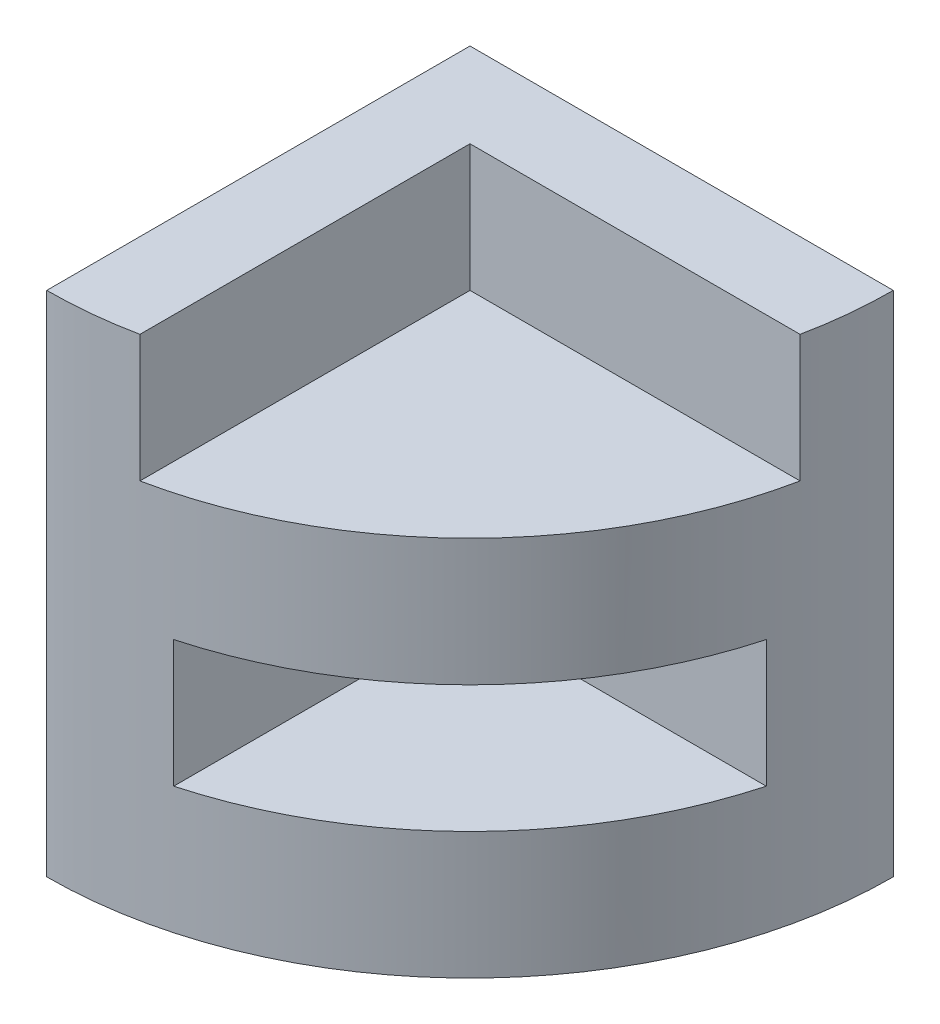
ISO-10303-21;
HEADER;
FILE_DESCRIPTION(('STEP AP214'),'2;1');
FILE_NAME('part.step','',(''),(''),'','','');
FILE_SCHEMA(('AUTOMOTIVE_DESIGN { 1 0 10303 214 1 1 1 1 }'));
ENDSEC;
DATA;
#1=APPLICATION_CONTEXT('core data for automotive mechanical design processes');
#2=APPLICATION_PROTOCOL_DEFINITION('international standard','automotive_design',2000,#1);
#3=PRODUCT_CONTEXT('',#1,'mechanical');
#4=PRODUCT('Part','Part','',(#3));
#5=PRODUCT_RELATED_PRODUCT_CATEGORY('part','',(#4));
#6=PRODUCT_DEFINITION_FORMATION('','',#4);
#7=PRODUCT_DEFINITION_CONTEXT('part definition',#1,'design');
#8=PRODUCT_DEFINITION('design','',#6,#7);
#9=PRODUCT_DEFINITION_SHAPE('','',#8);
#10=(LENGTH_UNIT() NAMED_UNIT(*) SI_UNIT(.MILLI.,.METRE.));
#11=(NAMED_UNIT(*) PLANE_ANGLE_UNIT() SI_UNIT($,.RADIAN.));
#12=(NAMED_UNIT(*) SI_UNIT($,.STERADIAN.) SOLID_ANGLE_UNIT());
#13=UNCERTAINTY_MEASURE_WITH_UNIT(LENGTH_MEASURE(1.E-05),#10,'distance_accuracy_value','');
#14=(GEOMETRIC_REPRESENTATION_CONTEXT(3) GLOBAL_UNCERTAINTY_ASSIGNED_CONTEXT((#13)) GLOBAL_UNIT_ASSIGNED_CONTEXT((#10,
#11,#12)) REPRESENTATION_CONTEXT('',''));
#15=CARTESIAN_POINT('',(0.,0.,0.));
#16=DIRECTION('',(0.,0.,1.));
#17=DIRECTION('',(1.,0.,0.));
#18=AXIS2_PLACEMENT_3D('',#15,#16,#17);
#19=CARTESIAN_POINT('',(0.,4.5,0.));
#20=DIRECTION('',(0.,-1.,0.));
#21=DIRECTION('',(0.,0.,-1.));
#22=AXIS2_PLACEMENT_3D('',#19,#20,#21);
#23=PLANE('',#22);
#24=DIRECTION('',(1.,0.,0.));
#25=VECTOR('',#24,1.);
#26=CARTESIAN_POINT('',(4.89897948556636,4.5,0.999999999999999));
#27=LINE('',#26,#25);
#28=CARTESIAN_POINT('',(1.,4.5,0.999999999999999));
#29=VERTEX_POINT('',#28);
#30=CARTESIAN_POINT('',(4.89897948556636,4.5,0.999999999999998));
#31=VERTEX_POINT('',#30);
#32=EDGE_CURVE('E126',#29,#31,#27,.T.);
#33=ORIENTED_EDGE('',*,*,#32,.F.);
#34=DIRECTION('',(0.,0.,-1.));
#35=VECTOR('',#34,1.);
#36=CARTESIAN_POINT('',(1.,4.5,0.999999999999999));
#37=LINE('',#36,#35);
#38=CARTESIAN_POINT('',(1.,4.5,4.89897948556636));
#39=VERTEX_POINT('',#38);
#40=EDGE_CURVE('E54',#39,#29,#37,.T.);
#41=ORIENTED_EDGE('',*,*,#40,.F.);
#42=CARTESIAN_POINT('',(0.,4.5,0.));
#43=DIRECTION('',(0.,1.,0.));
#44=DIRECTION('',(0.,0.,-1.));
#45=AXIS2_PLACEMENT_3D('',#42,#43,#44);
#46=CIRCLE('',#45,5.);
#47=EDGE_CURVE('E50',#39,#31,#46,.T.);
#48=ORIENTED_EDGE('',*,*,#47,.T.);
#49=EDGE_LOOP('',(#33,#41,#48));
#50=FACE_BOUND('',#49,.T.);
#51=ADVANCED_FACE('F33',(#50),#23,.F.);
#52=CARTESIAN_POINT('',(0.,4.5,0.));
#53=DIRECTION('',(0.,-1.,0.));
#54=DIRECTION('',(0.,0.,-1.));
#55=AXIS2_PLACEMENT_3D('',#52,#53,#54);
#56=CYLINDRICAL_SURFACE('',#55,5.);
#57=CARTESIAN_POINT('',(0.,0.,0.));
#58=DIRECTION('',(0.,1.,0.));
#59=DIRECTION('',(0.,0.,-1.));
#60=AXIS2_PLACEMENT_3D('',#57,#58,#59);
#61=CIRCLE('',#60,5.);
#62=CARTESIAN_POINT('',(0.,0.,5.));
#63=VERTEX_POINT('',#62);
#64=CARTESIAN_POINT('',(5.,0.,0.));
#65=VERTEX_POINT('',#64);
#66=EDGE_CURVE('E173',#63,#65,#61,.T.);
#67=ORIENTED_EDGE('',*,*,#66,.T.);
#68=DIRECTION('',(0.,-1.,0.));
#69=VECTOR('',#68,1.);
#70=CARTESIAN_POINT('',(5.,4.5,0.));
#71=LINE('',#70,#69);
#72=CARTESIAN_POINT('',(5.,6.,0.));
#73=VERTEX_POINT('',#72);
#74=EDGE_CURVE('E42',#73,#65,#71,.T.);
#75=ORIENTED_EDGE('',*,*,#74,.F.);
#76=CARTESIAN_POINT('',(0.,6.,0.));
#77=DIRECTION('',(0.,1.,0.));
#78=DIRECTION('',(0.,0.,1.));
#79=AXIS2_PLACEMENT_3D('',#76,#77,#78);
#80=CIRCLE('',#79,5.);
#81=CARTESIAN_POINT('',(4.89897948556636,6.,0.999999999999999));
#82=VERTEX_POINT('',#81);
#83=EDGE_CURVE('E125',#82,#73,#80,.T.);
#84=ORIENTED_EDGE('',*,*,#83,.F.);
#85=DIRECTION('',(0.,-1.,0.));
#86=VECTOR('',#85,1.);
#87=CARTESIAN_POINT('',(4.89897948556636,6.,0.999999999999999));
#88=LINE('',#87,#86);
#89=EDGE_CURVE('E136',#82,#31,#88,.T.);
#90=ORIENTED_EDGE('',*,*,#89,.T.);
#91=ORIENTED_EDGE('',*,*,#47,.F.);
#92=DIRECTION('',(0.,-1.,0.));
#93=VECTOR('',#92,1.);
#94=CARTESIAN_POINT('',(1.,6.,4.89897948556635));
#95=LINE('',#94,#93);
#96=CARTESIAN_POINT('',(1.,6.,4.89897948556635));
#97=VERTEX_POINT('',#96);
#98=EDGE_CURVE('E148',#97,#39,#95,.T.);
#99=ORIENTED_EDGE('',*,*,#98,.F.);
#100=CARTESIAN_POINT('',(0.,6.,0.));
#101=DIRECTION('',(0.,1.,0.));
#102=DIRECTION('',(0.,0.,1.));
#103=AXIS2_PLACEMENT_3D('',#100,#101,#102);
#104=CIRCLE('',#103,5.);
#105=CARTESIAN_POINT('',(0.,6.,5.));
#106=VERTEX_POINT('',#105);
#107=EDGE_CURVE('E120',#106,#97,#104,.T.);
#108=ORIENTED_EDGE('',*,*,#107,.F.);
#109=DIRECTION('',(0.,-1.,0.));
#110=VECTOR('',#109,1.);
#111=CARTESIAN_POINT('',(0.,4.5,5.));
#112=LINE('',#111,#110);
#113=EDGE_CURVE('E11',#106,#63,#112,.T.);
#114=ORIENTED_EDGE('',*,*,#113,.T.);
#115=EDGE_LOOP('',(#67,#75,#84,#90,#91,#99,#108,#114));
#116=FACE_BOUND('',#115,.T.);
#117=CARTESIAN_POINT('',(0.,1.5,0.));
#118=DIRECTION('',(0.,1.,0.));
#119=DIRECTION('',(0.,0.,1.));
#120=AXIS2_PLACEMENT_3D('',#117,#118,#119);
#121=CIRCLE('',#120,5.);
#122=CARTESIAN_POINT('',(1.32205143186113,1.5,4.82205143186113));
#123=VERTEX_POINT('',#122);
#124=CARTESIAN_POINT('',(4.82205143186113,1.5,1.32205143186113));
#125=VERTEX_POINT('',#124);
#126=EDGE_CURVE('E304',#123,#125,#121,.T.);
#127=ORIENTED_EDGE('',*,*,#126,.F.);
#128=DIRECTION('',(0.,1.,0.));
#129=VECTOR('',#128,1.);
#130=CARTESIAN_POINT('',(1.32205143186113,1.5,4.82205143186113));
#131=LINE('',#130,#129);
#132=CARTESIAN_POINT('',(1.32205143186113,3.,4.82205143186113));
#133=VERTEX_POINT('',#132);
#134=EDGE_CURVE('E174',#123,#133,#131,.T.);
#135=ORIENTED_EDGE('',*,*,#134,.T.);
#136=CARTESIAN_POINT('',(0.,3.,0.));
#137=DIRECTION('',(0.,1.,0.));
#138=DIRECTION('',(0.,0.,1.));
#139=AXIS2_PLACEMENT_3D('',#136,#137,#138);
#140=CIRCLE('',#139,5.);
#141=CARTESIAN_POINT('',(4.82205143186113,3.,1.32205143186113));
#142=VERTEX_POINT('',#141);
#143=EDGE_CURVE('E153',#133,#142,#140,.T.);
#144=ORIENTED_EDGE('',*,*,#143,.T.);
#145=DIRECTION('',(0.,1.,0.));
#146=VECTOR('',#145,1.);
#147=CARTESIAN_POINT('',(4.82205143186113,1.5,1.32205143186113));
#148=LINE('',#147,#146);
#149=EDGE_CURVE('E169',#125,#142,#148,.T.);
#150=ORIENTED_EDGE('',*,*,#149,.F.);
#151=EDGE_LOOP('',(#127,#135,#144,#150));
#152=FACE_BOUND('',#151,.T.);
#153=ADVANCED_FACE('F178',(#116,#152),#56,.T.);
#154=CARTESIAN_POINT('',(0.,4.5,5.));
#155=DIRECTION('',(1.,0.,0.));
#156=DIRECTION('',(0.,0.,-1.));
#157=AXIS2_PLACEMENT_3D('',#154,#155,#156);
#158=PLANE('',#157);
#159=DIRECTION('',(0.,0.,1.));
#160=VECTOR('',#159,1.);
#161=CARTESIAN_POINT('',(0.,0.,5.));
#162=LINE('',#161,#160);
#163=CARTESIAN_POINT('',(0.,0.,0.));
#164=VERTEX_POINT('',#163);
#165=EDGE_CURVE('E171',#164,#63,#162,.T.);
#166=ORIENTED_EDGE('',*,*,#165,.T.);
#167=ORIENTED_EDGE('',*,*,#113,.F.);
#168=DIRECTION('',(0.,0.,1.));
#169=VECTOR('',#168,1.);
#170=CARTESIAN_POINT('',(0.,6.,0.));
#171=LINE('',#170,#169);
#172=CARTESIAN_POINT('',(0.,6.,0.));
#173=VERTEX_POINT('',#172);
#174=EDGE_CURVE('E117',#173,#106,#171,.T.);
#175=ORIENTED_EDGE('',*,*,#174,.F.);
#176=DIRECTION('',(0.,-1.,0.));
#177=VECTOR('',#176,1.);
#178=CARTESIAN_POINT('',(0.,4.5,0.));
#179=LINE('',#178,#177);
#180=EDGE_CURVE('E104',#173,#164,#179,.T.);
#181=ORIENTED_EDGE('',*,*,#180,.T.);
#182=EDGE_LOOP('',(#166,#167,#175,#181));
#183=FACE_BOUND('',#182,.T.);
#184=ADVANCED_FACE('F35',(#183),#158,.F.);
#185=CARTESIAN_POINT('',(0.,4.5,0.));
#186=DIRECTION('',(0.,0.,1.));
#187=DIRECTION('',(1.,0.,0.));
#188=AXIS2_PLACEMENT_3D('',#185,#186,#187);
#189=PLANE('',#188);
#190=DIRECTION('',(-1.,0.,0.));
#191=VECTOR('',#190,1.);
#192=CARTESIAN_POINT('',(0.,0.,0.));
#193=LINE('',#192,#191);
#194=EDGE_CURVE('E111',#65,#164,#193,.T.);
#195=ORIENTED_EDGE('',*,*,#194,.T.);
#196=ORIENTED_EDGE('',*,*,#180,.F.);
#197=DIRECTION('',(-1.,0.,0.));
#198=VECTOR('',#197,1.);
#199=CARTESIAN_POINT('',(5.,6.,0.));
#200=LINE('',#199,#198);
#201=EDGE_CURVE('E109',#73,#173,#200,.T.);
#202=ORIENTED_EDGE('',*,*,#201,.F.);
#203=ORIENTED_EDGE('',*,*,#74,.T.);
#204=EDGE_LOOP('',(#195,#196,#202,#203));
#205=FACE_BOUND('',#204,.T.);
#206=ADVANCED_FACE('F106',(#205),#189,.F.);
#207=CARTESIAN_POINT('',(0.,0.,0.));
#208=DIRECTION('',(0.,-1.,0.));
#209=DIRECTION('',(0.,0.,-1.));
#210=AXIS2_PLACEMENT_3D('',#207,#208,#209);
#211=PLANE('',#210);
#212=ORIENTED_EDGE('',*,*,#165,.F.);
#213=ORIENTED_EDGE('',*,*,#194,.F.);
#214=ORIENTED_EDGE('',*,*,#66,.F.);
#215=EDGE_LOOP('',(#212,#213,#214));
#216=FACE_BOUND('',#215,.T.);
#217=ADVANCED_FACE('F177',(#216),#211,.T.);
#218=CARTESIAN_POINT('',(1.32205143186113,1.5,1.32205143186113));
#219=DIRECTION('',(-1.,0.,0.));
#220=DIRECTION('',(0.,0.,1.));
#221=AXIS2_PLACEMENT_3D('',#218,#219,#220);
#222=PLANE('',#221);
#223=DIRECTION('',(0.,0.,1.));
#224=VECTOR('',#223,1.);
#225=CARTESIAN_POINT('',(1.32205143186113,3.,1.32205143186113));
#226=LINE('',#225,#224);
#227=CARTESIAN_POINT('',(1.32205143186113,3.,1.32205143186113));
#228=VERTEX_POINT('',#227);
#229=EDGE_CURVE('E298',#228,#133,#226,.T.);
#230=ORIENTED_EDGE('',*,*,#229,.T.);
#231=ORIENTED_EDGE('',*,*,#134,.F.);
#232=DIRECTION('',(0.,0.,1.));
#233=VECTOR('',#232,1.);
#234=CARTESIAN_POINT('',(1.32205143186113,1.5,1.32205143186113));
#235=LINE('',#234,#233);
#236=CARTESIAN_POINT('',(1.32205143186113,1.5,1.32205143186113));
#237=VERTEX_POINT('',#236);
#238=EDGE_CURVE('E312',#237,#123,#235,.T.);
#239=ORIENTED_EDGE('',*,*,#238,.F.);
#240=DIRECTION('',(0.,1.,0.));
#241=VECTOR('',#240,1.);
#242=CARTESIAN_POINT('',(1.32205143186113,1.5,1.32205143186113));
#243=LINE('',#242,#241);
#244=EDGE_CURVE('E302',#237,#228,#243,.T.);
#245=ORIENTED_EDGE('',*,*,#244,.T.);
#246=EDGE_LOOP('',(#230,#231,#239,#245));
#247=FACE_BOUND('',#246,.T.);
#248=ADVANCED_FACE('F193',(#247),#222,.F.);
#249=CARTESIAN_POINT('',(4.82205143186113,1.5,1.32205143186113));
#250=DIRECTION('',(0.,0.,-1.));
#251=DIRECTION('',(-1.,0.,0.));
#252=AXIS2_PLACEMENT_3D('',#249,#250,#251);
#253=PLANE('',#252);
#254=DIRECTION('',(-1.,0.,0.));
#255=VECTOR('',#254,1.);
#256=CARTESIAN_POINT('',(4.82205143186113,3.,1.32205143186113));
#257=LINE('',#256,#255);
#258=EDGE_CURVE('E158',#142,#228,#257,.T.);
#259=ORIENTED_EDGE('',*,*,#258,.T.);
#260=ORIENTED_EDGE('',*,*,#244,.F.);
#261=DIRECTION('',(-1.,0.,0.));
#262=VECTOR('',#261,1.);
#263=CARTESIAN_POINT('',(4.82205143186113,1.5,1.32205143186113));
#264=LINE('',#263,#262);
#265=EDGE_CURVE('E314',#125,#237,#264,.T.);
#266=ORIENTED_EDGE('',*,*,#265,.F.);
#267=ORIENTED_EDGE('',*,*,#149,.T.);
#268=EDGE_LOOP('',(#259,#260,#266,#267));
#269=FACE_BOUND('',#268,.T.);
#270=ADVANCED_FACE('F189',(#269),#253,.F.);
#271=CARTESIAN_POINT('',(0.,1.5,0.));
#272=DIRECTION('',(0.,1.,0.));
#273=DIRECTION('',(0.,0.,1.));
#274=AXIS2_PLACEMENT_3D('',#271,#272,#273);
#275=PLANE('',#274);
#276=ORIENTED_EDGE('',*,*,#126,.T.);
#277=ORIENTED_EDGE('',*,*,#265,.T.);
#278=ORIENTED_EDGE('',*,*,#238,.T.);
#279=EDGE_LOOP('',(#276,#277,#278));
#280=FACE_BOUND('',#279,.T.);
#281=ADVANCED_FACE('F219',(#280),#275,.T.);
#282=CARTESIAN_POINT('',(0.,3.,0.));
#283=DIRECTION('',(0.,1.,0.));
#284=DIRECTION('',(0.,0.,1.));
#285=AXIS2_PLACEMENT_3D('',#282,#283,#284);
#286=PLANE('',#285);
#287=ORIENTED_EDGE('',*,*,#143,.F.);
#288=ORIENTED_EDGE('',*,*,#229,.F.);
#289=ORIENTED_EDGE('',*,*,#258,.F.);
#290=EDGE_LOOP('',(#287,#288,#289));
#291=FACE_BOUND('',#290,.T.);
#292=ADVANCED_FACE('F215',(#291),#286,.F.);
#293=CARTESIAN_POINT('',(1.,6.,0.999999999999999));
#294=DIRECTION('',(-1.,0.,0.));
#295=DIRECTION('',(0.,0.,1.));
#296=AXIS2_PLACEMENT_3D('',#293,#294,#295);
#297=PLANE('',#296);
#298=ORIENTED_EDGE('',*,*,#40,.T.);
#299=DIRECTION('',(0.,-1.,0.));
#300=VECTOR('',#299,1.);
#301=CARTESIAN_POINT('',(1.,6.,0.999999999999999));
#302=LINE('',#301,#300);
#303=CARTESIAN_POINT('',(1.,6.,0.999999999999999));
#304=VERTEX_POINT('',#303);
#305=EDGE_CURVE('E139',#304,#29,#302,.T.);
#306=ORIENTED_EDGE('',*,*,#305,.F.);
#307=DIRECTION('',(0.,0.,-1.));
#308=VECTOR('',#307,1.);
#309=CARTESIAN_POINT('',(1.,6.,0.999999999999999));
#310=LINE('',#309,#308);
#311=EDGE_CURVE('E131',#97,#304,#310,.T.);
#312=ORIENTED_EDGE('',*,*,#311,.F.);
#313=ORIENTED_EDGE('',*,*,#98,.T.);
#314=EDGE_LOOP('',(#298,#306,#312,#313));
#315=FACE_BOUND('',#314,.T.);
#316=ADVANCED_FACE('F180',(#315),#297,.F.);
#317=CARTESIAN_POINT('',(4.89897948556636,6.,0.999999999999999));
#318=DIRECTION('',(0.,0.,-1.));
#319=DIRECTION('',(-1.,0.,0.));
#320=AXIS2_PLACEMENT_3D('',#317,#318,#319);
#321=PLANE('',#320);
#322=ORIENTED_EDGE('',*,*,#32,.T.);
#323=ORIENTED_EDGE('',*,*,#89,.F.);
#324=DIRECTION('',(1.,0.,0.));
#325=VECTOR('',#324,1.);
#326=CARTESIAN_POINT('',(4.89897948556636,6.,0.999999999999999));
#327=LINE('',#326,#325);
#328=EDGE_CURVE('E133',#304,#82,#327,.T.);
#329=ORIENTED_EDGE('',*,*,#328,.F.);
#330=ORIENTED_EDGE('',*,*,#305,.T.);
#331=EDGE_LOOP('',(#322,#323,#329,#330));
#332=FACE_BOUND('',#331,.T.);
#333=ADVANCED_FACE('F181',(#332),#321,.F.);
#334=CARTESIAN_POINT('',(0.,6.,0.));
#335=DIRECTION('',(0.,1.,0.));
#336=DIRECTION('',(0.,0.,1.));
#337=AXIS2_PLACEMENT_3D('',#334,#335,#336);
#338=PLANE('',#337);
#339=ORIENTED_EDGE('',*,*,#201,.T.);
#340=ORIENTED_EDGE('',*,*,#174,.T.);
#341=ORIENTED_EDGE('',*,*,#107,.T.);
#342=ORIENTED_EDGE('',*,*,#311,.T.);
#343=ORIENTED_EDGE('',*,*,#328,.T.);
#344=ORIENTED_EDGE('',*,*,#83,.T.);
#345=EDGE_LOOP('',(#339,#340,#341,#342,#343,#344));
#346=FACE_BOUND('',#345,.T.);
#347=ADVANCED_FACE('F123',(#346),#338,.T.);
#348=CLOSED_SHELL('',(#51,#153,#184,#206,#217,#248,#270,#281,#292,#316,#333,#347));
#349=MANIFOLD_SOLID_BREP('B2',#348);
#350=ADVANCED_BREP_SHAPE_REPRESENTATION('',(#18,#349),#14);
#351=SHAPE_DEFINITION_REPRESENTATION(#9,#350);
ENDSEC;
END-ISO-10303-21;
